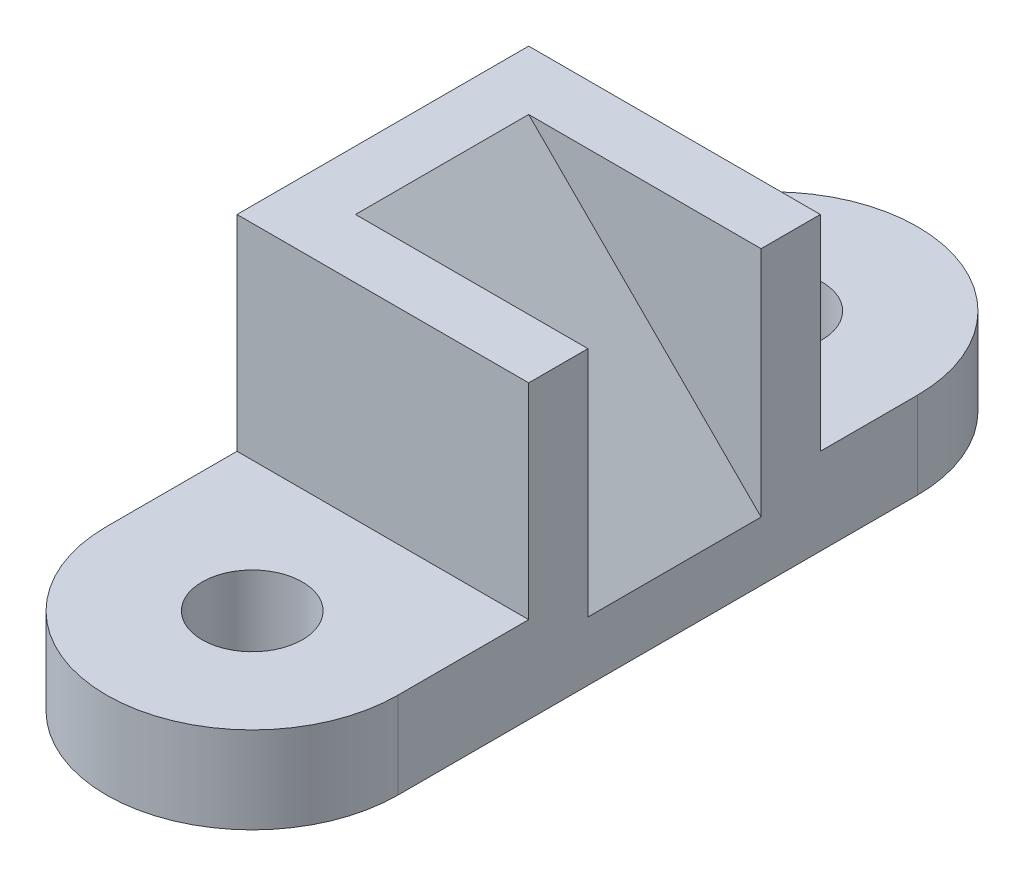
ISO-10303-21;
HEADER;
FILE_DESCRIPTION(('STEP AP214'),'2;1');
FILE_NAME('part.step','',(''),(''),'','','');
FILE_SCHEMA(('AUTOMOTIVE_DESIGN { 1 0 10303 214 1 1 1 1 }'));
ENDSEC;
DATA;
#1=APPLICATION_CONTEXT('core data for automotive mechanical design processes');
#2=APPLICATION_PROTOCOL_DEFINITION('international standard','automotive_design',2000,#1);
#3=PRODUCT_CONTEXT('',#1,'mechanical');
#4=PRODUCT('Part','Part','',(#3));
#5=PRODUCT_RELATED_PRODUCT_CATEGORY('part','',(#4));
#6=PRODUCT_DEFINITION_FORMATION('','',#4);
#7=PRODUCT_DEFINITION_CONTEXT('part definition',#1,'design');
#8=PRODUCT_DEFINITION('design','',#6,#7);
#9=PRODUCT_DEFINITION_SHAPE('','',#8);
#10=(LENGTH_UNIT() NAMED_UNIT(*) SI_UNIT(.MILLI.,.METRE.));
#11=(NAMED_UNIT(*) PLANE_ANGLE_UNIT() SI_UNIT($,.RADIAN.));
#12=(NAMED_UNIT(*) SI_UNIT($,.STERADIAN.) SOLID_ANGLE_UNIT());
#13=UNCERTAINTY_MEASURE_WITH_UNIT(LENGTH_MEASURE(1.E-05),#10,'distance_accuracy_value','');
#14=(GEOMETRIC_REPRESENTATION_CONTEXT(3) GLOBAL_UNCERTAINTY_ASSIGNED_CONTEXT((#13)) GLOBAL_UNIT_ASSIGNED_CONTEXT((#10,
#11,#12)) REPRESENTATION_CONTEXT('',''));
#15=CARTESIAN_POINT('',(0.,0.,0.));
#16=DIRECTION('',(0.,0.,1.));
#17=DIRECTION('',(1.,0.,0.));
#18=AXIS2_PLACEMENT_3D('',#15,#16,#17);
#19=CARTESIAN_POINT('',(0.,640.,156.794238497178));
#20=DIRECTION('',(0.,0.,1.));
#21=DIRECTION('',(1.,0.,0.));
#22=AXIS2_PLACEMENT_3D('',#19,#20,#21);
#23=PLANE('',#22);
#24=DIRECTION('',(-0.707106781186561,0.707106781186534,0.));
#25=VECTOR('',#24,1.);
#26=CARTESIAN_POINT('',(-192.180061252515,640.,156.794238497178));
#27=LINE('',#26,#25);
#28=CARTESIAN_POINT('',(317.819938747505,130.,156.794238497178));
#29=VERTEX_POINT('',#28);
#30=CARTESIAN_POINT('',(-192.180061252515,640.,156.794238497178));
#31=VERTEX_POINT('',#30);
#32=EDGE_CURVE('E50',#29,#31,#27,.T.);
#33=ORIENTED_EDGE('',*,*,#32,.T.);
#34=DIRECTION('',(-1.,0.,0.));
#35=VECTOR('',#34,1.);
#36=CARTESIAN_POINT('',(0.,640.,156.794238497178));
#37=LINE('',#36,#35);
#38=CARTESIAN_POINT('',(317.819938747505,640.,156.794238497178));
#39=VERTEX_POINT('',#38);
#40=EDGE_CURVE('E123',#39,#31,#37,.T.);
#41=ORIENTED_EDGE('',*,*,#40,.F.);
#42=DIRECTION('',(0.,-1.,0.));
#43=VECTOR('',#42,1.);
#44=CARTESIAN_POINT('',(317.819938747505,640.,156.794238497178));
#45=LINE('',#44,#43);
#46=EDGE_CURVE('E128',#39,#29,#45,.T.);
#47=ORIENTED_EDGE('',*,*,#46,.T.);
#48=EDGE_LOOP('',(#33,#41,#47));
#49=FACE_BOUND('',#48,.T.);
#50=ADVANCED_FACE('F35',(#49),#23,.F.);
#51=CARTESIAN_POINT('',(0.,640.,-223.205761502822));
#52=DIRECTION('',(0.,0.,-1.));
#53=DIRECTION('',(-1.,0.,0.));
#54=AXIS2_PLACEMENT_3D('',#51,#52,#53);
#55=PLANE('',#54);
#56=DIRECTION('',(-0.707106781186561,0.707106781186534,0.));
#57=VECTOR('',#56,1.);
#58=CARTESIAN_POINT('',(-192.180061252515,640.,-223.205761502822));
#59=LINE('',#58,#57);
#60=CARTESIAN_POINT('',(317.819938747505,130.,-223.205761502822));
#61=VERTEX_POINT('',#60);
#62=CARTESIAN_POINT('',(-192.180061252515,640.,-223.205761502822));
#63=VERTEX_POINT('',#62);
#64=EDGE_CURVE('E118',#61,#63,#59,.T.);
#65=ORIENTED_EDGE('',*,*,#64,.F.);
#66=DIRECTION('',(0.,-1.,0.));
#67=VECTOR('',#66,1.);
#68=CARTESIAN_POINT('',(317.819938747505,640.,-223.205761502822));
#69=LINE('',#68,#67);
#70=CARTESIAN_POINT('',(317.819938747505,640.,-223.205761502822));
#71=VERTEX_POINT('',#70);
#72=EDGE_CURVE('E144',#71,#61,#69,.T.);
#73=ORIENTED_EDGE('',*,*,#72,.F.);
#74=DIRECTION('',(1.,0.,0.));
#75=VECTOR('',#74,1.);
#76=CARTESIAN_POINT('',(0.,640.,-223.205761502822));
#77=LINE('',#76,#75);
#78=EDGE_CURVE('E122',#63,#71,#77,.T.);
#79=ORIENTED_EDGE('',*,*,#78,.F.);
#80=EDGE_LOOP('',(#65,#73,#79));
#81=FACE_BOUND('',#80,.T.);
#82=ADVANCED_FACE('F245',(#81),#55,.F.);
#83=CARTESIAN_POINT('',(-2.18006125250547,190.,573.391608020131));
#84=DIRECTION('',(0.,-1.,0.));
#85=DIRECTION('',(0.,0.,-1.));
#86=AXIS2_PLACEMENT_3D('',#83,#84,#85);
#87=CYLINDRICAL_SURFACE('',#86,320.00000000001);
#88=CARTESIAN_POINT('',(-2.18006125250547,0.,573.391608020131));
#89=DIRECTION('',(0.,1.,0.));
#90=DIRECTION('',(0.,0.,1.));
#91=AXIS2_PLACEMENT_3D('',#88,#89,#90);
#92=CIRCLE('',#91,320.00000000001);
#93=CARTESIAN_POINT('',(317.819938747505,0.,573.391608020131));
#94=VERTEX_POINT('',#93);
#95=CARTESIAN_POINT('',(-322.180061252515,0.,573.391608020131));
#96=VERTEX_POINT('',#95);
#97=EDGE_CURVE('E157',#94,#96,#92,.F.);
#98=ORIENTED_EDGE('',*,*,#97,.F.);
#99=DIRECTION('',(0.,-1.,0.));
#100=VECTOR('',#99,1.);
#101=CARTESIAN_POINT('',(317.819938747505,190.,573.391608020131));
#102=LINE('',#101,#100);
#103=CARTESIAN_POINT('',(317.819938747505,190.,573.391608020131));
#104=VERTEX_POINT('',#103);
#105=EDGE_CURVE('E11',#104,#94,#102,.T.);
#106=ORIENTED_EDGE('',*,*,#105,.F.);
#107=CARTESIAN_POINT('',(-2.18006125250547,190.,573.391608020131));
#108=DIRECTION('',(0.,1.,0.));
#109=DIRECTION('',(0.,0.,1.));
#110=AXIS2_PLACEMENT_3D('',#107,#108,#109);
#111=CIRCLE('',#110,320.00000000001);
#112=CARTESIAN_POINT('',(-322.180061252515,190.,573.391608020131));
#113=VERTEX_POINT('',#112);
#114=EDGE_CURVE('E158',#104,#113,#111,.F.);
#115=ORIENTED_EDGE('',*,*,#114,.T.);
#116=DIRECTION('',(0.,-1.,0.));
#117=VECTOR('',#116,1.);
#118=CARTESIAN_POINT('',(-322.180061252515,190.,573.391608020131));
#119=LINE('',#118,#117);
#120=EDGE_CURVE('E43',#113,#96,#119,.T.);
#121=ORIENTED_EDGE('',*,*,#120,.T.);
#122=EDGE_LOOP('',(#98,#106,#115,#121));
#123=FACE_BOUND('',#122,.T.);
#124=ADVANCED_FACE('F37',(#123),#87,.T.);
#125=CARTESIAN_POINT('',(317.819938747505,190.,0.));
#126=DIRECTION('',(1.,0.,0.));
#127=DIRECTION('',(0.,0.,-1.));
#128=AXIS2_PLACEMENT_3D('',#125,#126,#127);
#129=PLANE('',#128);
#130=DIRECTION('',(0.,0.,1.));
#131=VECTOR('',#130,1.);
#132=CARTESIAN_POINT('',(317.819938747505,0.,0.));
#133=LINE('',#132,#131);
#134=CARTESIAN_POINT('',(317.819938747505,0.,-566.608391979868));
#135=VERTEX_POINT('',#134);
#136=EDGE_CURVE('E175',#135,#94,#133,.T.);
#137=ORIENTED_EDGE('',*,*,#136,.F.);
#138=DIRECTION('',(0.,-1.,0.));
#139=VECTOR('',#138,1.);
#140=CARTESIAN_POINT('',(317.819938747505,190.,-566.608391979868));
#141=LINE('',#140,#139);
#142=CARTESIAN_POINT('',(317.819938747505,190.,-566.608391979868));
#143=VERTEX_POINT('',#142);
#144=EDGE_CURVE('E202',#143,#135,#141,.T.);
#145=ORIENTED_EDGE('',*,*,#144,.F.);
#146=DIRECTION('',(0.,0.,1.));
#147=VECTOR('',#146,1.);
#148=CARTESIAN_POINT('',(317.819938747505,190.,0.));
#149=LINE('',#148,#147);
#150=CARTESIAN_POINT('',(317.819938747505,190.,-353.205761502822));
#151=VERTEX_POINT('',#150);
#152=EDGE_CURVE('E213',#143,#151,#149,.T.);
#153=ORIENTED_EDGE('',*,*,#152,.T.);
#154=DIRECTION('',(0.,-1.,0.));
#155=VECTOR('',#154,1.);
#156=CARTESIAN_POINT('',(317.819938747505,640.,-353.205761502822));
#157=LINE('',#156,#155);
#158=CARTESIAN_POINT('',(317.819938747505,640.,-353.205761502822));
#159=VERTEX_POINT('',#158);
#160=EDGE_CURVE('E155',#159,#151,#157,.T.);
#161=ORIENTED_EDGE('',*,*,#160,.F.);
#162=DIRECTION('',(0.,0.,1.));
#163=VECTOR('',#162,1.);
#164=CARTESIAN_POINT('',(317.819938747505,640.,0.));
#165=LINE('',#164,#163);
#166=EDGE_CURVE('E139',#159,#71,#165,.T.);
#167=ORIENTED_EDGE('',*,*,#166,.T.);
#168=ORIENTED_EDGE('',*,*,#72,.T.);
#169=DIRECTION('',(0.,0.,1.));
#170=VECTOR('',#169,1.);
#171=CARTESIAN_POINT('',(317.819938747505,130.,0.));
#172=LINE('',#171,#170);
#173=EDGE_CURVE('E230',#61,#29,#172,.T.);
#174=ORIENTED_EDGE('',*,*,#173,.T.);
#175=ORIENTED_EDGE('',*,*,#46,.F.);
#176=CARTESIAN_POINT('',(317.819938747505,640.,286.794238497178));
#177=VERTEX_POINT('',#176);
#178=EDGE_CURVE('E135',#39,#177,#165,.T.);
#179=ORIENTED_EDGE('',*,*,#178,.T.);
#180=DIRECTION('',(0.,-1.,0.));
#181=VECTOR('',#180,1.);
#182=CARTESIAN_POINT('',(317.819938747505,640.,286.794238497178));
#183=LINE('',#182,#181);
#184=CARTESIAN_POINT('',(317.819938747505,190.,286.794238497178));
#185=VERTEX_POINT('',#184);
#186=EDGE_CURVE('E148',#177,#185,#183,.T.);
#187=ORIENTED_EDGE('',*,*,#186,.T.);
#188=DIRECTION('',(0.,0.,1.));
#189=VECTOR('',#188,1.);
#190=CARTESIAN_POINT('',(317.819938747505,190.,0.));
#191=LINE('',#190,#189);
#192=EDGE_CURVE('E161',#185,#104,#191,.T.);
#193=ORIENTED_EDGE('',*,*,#192,.T.);
#194=ORIENTED_EDGE('',*,*,#105,.T.);
#195=EDGE_LOOP('',(#137,#145,#153,#161,#167,#168,#174,#175,#179,#187,#193,#194));
#196=FACE_BOUND('',#195,.T.);
#197=ADVANCED_FACE('F200',(#196),#129,.T.);
#198=CARTESIAN_POINT('',(-322.180061252515,190.,0.));
#199=DIRECTION('',(1.,0.,0.));
#200=DIRECTION('',(0.,0.,-1.));
#201=AXIS2_PLACEMENT_3D('',#198,#199,#200);
#202=PLANE('',#201);
#203=DIRECTION('',(0.,0.,1.));
#204=VECTOR('',#203,1.);
#205=CARTESIAN_POINT('',(-322.180061252515,0.,0.));
#206=LINE('',#205,#204);
#207=CARTESIAN_POINT('',(-322.180061252515,0.,-566.608391979869));
#208=VERTEX_POINT('',#207);
#209=EDGE_CURVE('E178',#208,#96,#206,.T.);
#210=ORIENTED_EDGE('',*,*,#209,.T.);
#211=ORIENTED_EDGE('',*,*,#120,.F.);
#212=DIRECTION('',(0.,0.,1.));
#213=VECTOR('',#212,1.);
#214=CARTESIAN_POINT('',(-322.180061252515,190.,0.));
#215=LINE('',#214,#213);
#216=CARTESIAN_POINT('',(-322.180061252515,190.,286.794238497178));
#217=VERTEX_POINT('',#216);
#218=EDGE_CURVE('E168',#217,#113,#215,.T.);
#219=ORIENTED_EDGE('',*,*,#218,.F.);
#220=DIRECTION('',(0.,-1.,0.));
#221=VECTOR('',#220,1.);
#222=CARTESIAN_POINT('',(-322.180061252515,640.,286.794238497178));
#223=LINE('',#222,#221);
#224=CARTESIAN_POINT('',(-322.180061252515,640.,286.794238497178));
#225=VERTEX_POINT('',#224);
#226=EDGE_CURVE('E151',#225,#217,#223,.T.);
#227=ORIENTED_EDGE('',*,*,#226,.F.);
#228=DIRECTION('',(0.,0.,1.));
#229=VECTOR('',#228,1.);
#230=CARTESIAN_POINT('',(-322.180061252515,640.,0.));
#231=LINE('',#230,#229);
#232=CARTESIAN_POINT('',(-322.180061252515,640.,-353.205761502822));
#233=VERTEX_POINT('',#232);
#234=EDGE_CURVE('E222',#233,#225,#231,.T.);
#235=ORIENTED_EDGE('',*,*,#234,.F.);
#236=DIRECTION('',(0.,-1.,0.));
#237=VECTOR('',#236,1.);
#238=CARTESIAN_POINT('',(-322.180061252515,640.,-353.205761502822));
#239=LINE('',#238,#237);
#240=CARTESIAN_POINT('',(-322.180061252515,190.,-353.205761502822));
#241=VERTEX_POINT('',#240);
#242=EDGE_CURVE('E153',#233,#241,#239,.T.);
#243=ORIENTED_EDGE('',*,*,#242,.T.);
#244=DIRECTION('',(0.,0.,1.));
#245=VECTOR('',#244,1.);
#246=CARTESIAN_POINT('',(-322.180061252515,190.,0.));
#247=LINE('',#246,#245);
#248=CARTESIAN_POINT('',(-322.180061252515,190.,-566.608391979869));
#249=VERTEX_POINT('',#248);
#250=EDGE_CURVE('E236',#249,#241,#247,.T.);
#251=ORIENTED_EDGE('',*,*,#250,.F.);
#252=DIRECTION('',(0.,-1.,0.));
#253=VECTOR('',#252,1.);
#254=CARTESIAN_POINT('',(-322.180061252515,190.,-566.608391979869));
#255=LINE('',#254,#253);
#256=EDGE_CURVE('E191',#249,#208,#255,.T.);
#257=ORIENTED_EDGE('',*,*,#256,.T.);
#258=EDGE_LOOP('',(#210,#211,#219,#227,#235,#243,#251,#257));
#259=FACE_BOUND('',#258,.T.);
#260=ADVANCED_FACE('F189',(#259),#202,.F.);
#261=CARTESIAN_POINT('',(-2.18006125250547,190.,573.391608020131));
#262=DIRECTION('',(0.,-1.,0.));
#263=DIRECTION('',(0.,0.,-1.));
#264=AXIS2_PLACEMENT_3D('',#261,#262,#263);
#265=CYLINDRICAL_SURFACE('',#264,110.);
#266=CARTESIAN_POINT('',(-2.18006125250547,190.,573.391608020131));
#267=DIRECTION('',(0.,1.,0.));
#268=DIRECTION('',(0.,0.,1.));
#269=AXIS2_PLACEMENT_3D('',#266,#267,#268);
#270=CIRCLE('',#269,110.);
#271=CARTESIAN_POINT('',(-2.18006125250547,190.,683.391608020131));
#272=VERTEX_POINT('',#271);
#273=EDGE_CURVE('E170',#272,#272,#270,.T.);
#274=ORIENTED_EDGE('',*,*,#273,.T.);
#275=EDGE_LOOP('',(#274));
#276=FACE_BOUND('',#275,.T.);
#277=CARTESIAN_POINT('',(-2.18006125250547,0.,573.391608020131));
#278=DIRECTION('',(0.,1.,0.));
#279=DIRECTION('',(0.,0.,1.));
#280=AXIS2_PLACEMENT_3D('',#277,#278,#279);
#281=CIRCLE('',#280,110.);
#282=CARTESIAN_POINT('',(-2.18006125250547,0.,683.391608020131));
#283=VERTEX_POINT('',#282);
#284=EDGE_CURVE('E162',#283,#283,#281,.T.);
#285=ORIENTED_EDGE('',*,*,#284,.F.);
#286=EDGE_LOOP('',(#285));
#287=FACE_BOUND('',#286,.T.);
#288=ADVANCED_FACE('F263',(#276,#287),#265,.F.);
#289=CARTESIAN_POINT('',(0.,190.,0.));
#290=DIRECTION('',(0.,1.,0.));
#291=DIRECTION('',(0.,0.,1.));
#292=AXIS2_PLACEMENT_3D('',#289,#290,#291);
#293=PLANE('',#292);
#294=ORIENTED_EDGE('',*,*,#114,.F.);
#295=ORIENTED_EDGE('',*,*,#192,.F.);
#296=DIRECTION('',(-1.,0.,0.));
#297=VECTOR('',#296,1.);
#298=CARTESIAN_POINT('',(0.,190.,286.794238497178));
#299=LINE('',#298,#297);
#300=EDGE_CURVE('E165',#185,#217,#299,.T.);
#301=ORIENTED_EDGE('',*,*,#300,.T.);
#302=ORIENTED_EDGE('',*,*,#218,.T.);
#303=EDGE_LOOP('',(#294,#295,#301,#302));
#304=FACE_BOUND('',#303,.T.);
#305=ORIENTED_EDGE('',*,*,#273,.F.);
#306=EDGE_LOOP('',(#305));
#307=FACE_BOUND('',#306,.T.);
#308=ADVANCED_FACE('F260',(#304,#307),#293,.T.);
#309=CARTESIAN_POINT('',(0.,0.,0.));
#310=DIRECTION('',(0.,1.,0.));
#311=DIRECTION('',(0.,0.,1.));
#312=AXIS2_PLACEMENT_3D('',#309,#310,#311);
#313=PLANE('',#312);
#314=CARTESIAN_POINT('',(-2.18006125250558,0.,-566.608391979869));
#315=DIRECTION('',(0.,1.,0.));
#316=DIRECTION('',(0.,0.,1.));
#317=AXIS2_PLACEMENT_3D('',#314,#315,#316);
#318=CIRCLE('',#317,320.00000000001);
#319=EDGE_CURVE('E197',#208,#135,#318,.F.);
#320=ORIENTED_EDGE('',*,*,#319,.T.);
#321=ORIENTED_EDGE('',*,*,#136,.T.);
#322=ORIENTED_EDGE('',*,*,#97,.T.);
#323=ORIENTED_EDGE('',*,*,#209,.F.);
#324=EDGE_LOOP('',(#320,#321,#322,#323));
#325=FACE_BOUND('',#324,.T.);
#326=ORIENTED_EDGE('',*,*,#284,.T.);
#327=EDGE_LOOP('',(#326));
#328=FACE_BOUND('',#327,.T.);
#329=CARTESIAN_POINT('',(-2.18006125250558,0.,-566.608391979869));
#330=DIRECTION('',(0.,1.,0.));
#331=DIRECTION('',(0.,0.,1.));
#332=AXIS2_PLACEMENT_3D('',#329,#330,#331);
#333=CIRCLE('',#332,110.);
#334=CARTESIAN_POINT('',(-2.18006125250558,0.,-456.608391979868));
#335=VERTEX_POINT('',#334);
#336=EDGE_CURVE('E216',#335,#335,#333,.T.);
#337=ORIENTED_EDGE('',*,*,#336,.T.);
#338=EDGE_LOOP('',(#337));
#339=FACE_BOUND('',#338,.T.);
#340=ADVANCED_FACE('F195',(#325,#328,#339),#313,.F.);
#341=CARTESIAN_POINT('',(0.,640.,286.794238497178));
#342=DIRECTION('',(0.,0.,1.));
#343=DIRECTION('',(1.,0.,0.));
#344=AXIS2_PLACEMENT_3D('',#341,#342,#343);
#345=PLANE('',#344);
#346=ORIENTED_EDGE('',*,*,#300,.F.);
#347=ORIENTED_EDGE('',*,*,#186,.F.);
#348=DIRECTION('',(-1.,0.,0.));
#349=VECTOR('',#348,1.);
#350=CARTESIAN_POINT('',(0.,640.,286.794238497178));
#351=LINE('',#350,#349);
#352=EDGE_CURVE('E137',#177,#225,#351,.T.);
#353=ORIENTED_EDGE('',*,*,#352,.T.);
#354=ORIENTED_EDGE('',*,*,#226,.T.);
#355=EDGE_LOOP('',(#346,#347,#353,#354));
#356=FACE_BOUND('',#355,.T.);
#357=ADVANCED_FACE('F228',(#356),#345,.T.);
#358=CARTESIAN_POINT('',(0.,640.,-353.205761502822));
#359=DIRECTION('',(0.,0.,-1.));
#360=DIRECTION('',(-1.,0.,0.));
#361=AXIS2_PLACEMENT_3D('',#358,#359,#360);
#362=PLANE('',#361);
#363=DIRECTION('',(1.,0.,0.));
#364=VECTOR('',#363,1.);
#365=CARTESIAN_POINT('',(0.,190.,-353.205761502822));
#366=LINE('',#365,#364);
#367=EDGE_CURVE('E58',#241,#151,#366,.T.);
#368=ORIENTED_EDGE('',*,*,#367,.F.);
#369=ORIENTED_EDGE('',*,*,#242,.F.);
#370=DIRECTION('',(1.,0.,0.));
#371=VECTOR('',#370,1.);
#372=CARTESIAN_POINT('',(0.,640.,-353.205761502822));
#373=LINE('',#372,#371);
#374=EDGE_CURVE('E220',#233,#159,#373,.T.);
#375=ORIENTED_EDGE('',*,*,#374,.T.);
#376=ORIENTED_EDGE('',*,*,#160,.T.);
#377=EDGE_LOOP('',(#368,#369,#375,#376));
#378=FACE_BOUND('',#377,.T.);
#379=ADVANCED_FACE('F243',(#378),#362,.T.);
#380=CARTESIAN_POINT('',(0.,640.,0.));
#381=DIRECTION('',(0.,1.,0.));
#382=DIRECTION('',(0.,0.,1.));
#383=AXIS2_PLACEMENT_3D('',#380,#381,#382);
#384=PLANE('',#383);
#385=ORIENTED_EDGE('',*,*,#166,.F.);
#386=ORIENTED_EDGE('',*,*,#374,.F.);
#387=ORIENTED_EDGE('',*,*,#234,.T.);
#388=ORIENTED_EDGE('',*,*,#352,.F.);
#389=ORIENTED_EDGE('',*,*,#178,.F.);
#390=ORIENTED_EDGE('',*,*,#40,.T.);
#391=DIRECTION('',(0.,0.,1.));
#392=VECTOR('',#391,1.);
#393=CARTESIAN_POINT('',(-192.180061252515,640.,0.));
#394=LINE('',#393,#392);
#395=EDGE_CURVE('E115',#63,#31,#394,.T.);
#396=ORIENTED_EDGE('',*,*,#395,.F.);
#397=ORIENTED_EDGE('',*,*,#78,.T.);
#398=EDGE_LOOP('',(#385,#386,#387,#388,#389,#390,#396,#397));
#399=FACE_BOUND('',#398,.T.);
#400=ADVANCED_FACE('F132',(#399),#384,.T.);
#401=CARTESIAN_POINT('',(-2.18006125250558,190.,-566.608391979869));
#402=DIRECTION('',(0.,-1.,0.));
#403=DIRECTION('',(0.,0.,-1.));
#404=AXIS2_PLACEMENT_3D('',#401,#402,#403);
#405=CYLINDRICAL_SURFACE('',#404,320.00000000001);
#406=ORIENTED_EDGE('',*,*,#319,.F.);
#407=ORIENTED_EDGE('',*,*,#256,.F.);
#408=CARTESIAN_POINT('',(-2.18006125250558,190.,-566.608391979869));
#409=DIRECTION('',(0.,1.,0.));
#410=DIRECTION('',(0.,0.,1.));
#411=AXIS2_PLACEMENT_3D('',#408,#409,#410);
#412=CIRCLE('',#411,320.00000000001);
#413=EDGE_CURVE('E207',#249,#143,#412,.F.);
#414=ORIENTED_EDGE('',*,*,#413,.T.);
#415=ORIENTED_EDGE('',*,*,#144,.T.);
#416=EDGE_LOOP('',(#406,#407,#414,#415));
#417=FACE_BOUND('',#416,.T.);
#418=ADVANCED_FACE('F205',(#417),#405,.T.);
#419=CARTESIAN_POINT('',(-2.18006125250558,190.,-566.608391979869));
#420=DIRECTION('',(0.,-1.,0.));
#421=DIRECTION('',(0.,0.,-1.));
#422=AXIS2_PLACEMENT_3D('',#419,#420,#421);
#423=CYLINDRICAL_SURFACE('',#422,110.);
#424=CARTESIAN_POINT('',(-2.18006125250558,190.,-566.608391979869));
#425=DIRECTION('',(0.,1.,0.));
#426=DIRECTION('',(0.,0.,1.));
#427=AXIS2_PLACEMENT_3D('',#424,#425,#426);
#428=CIRCLE('',#427,110.);
#429=CARTESIAN_POINT('',(-2.18006125250558,190.,-456.608391979868));
#430=VERTEX_POINT('',#429);
#431=EDGE_CURVE('E209',#430,#430,#428,.T.);
#432=ORIENTED_EDGE('',*,*,#431,.T.);
#433=EDGE_LOOP('',(#432));
#434=FACE_BOUND('',#433,.T.);
#435=ORIENTED_EDGE('',*,*,#336,.F.);
#436=EDGE_LOOP('',(#435));
#437=FACE_BOUND('',#436,.T.);
#438=ADVANCED_FACE('F314',(#434,#437),#423,.F.);
#439=CARTESIAN_POINT('',(0.,190.,0.));
#440=DIRECTION('',(0.,1.,0.));
#441=DIRECTION('',(0.,0.,1.));
#442=AXIS2_PLACEMENT_3D('',#439,#440,#441);
#443=PLANE('',#442);
#444=ORIENTED_EDGE('',*,*,#413,.F.);
#445=ORIENTED_EDGE('',*,*,#250,.T.);
#446=ORIENTED_EDGE('',*,*,#367,.T.);
#447=ORIENTED_EDGE('',*,*,#152,.F.);
#448=EDGE_LOOP('',(#444,#445,#446,#447));
#449=FACE_BOUND('',#448,.T.);
#450=ORIENTED_EDGE('',*,*,#431,.F.);
#451=EDGE_LOOP('',(#450));
#452=FACE_BOUND('',#451,.T.);
#453=ADVANCED_FACE('F241',(#449,#452),#443,.T.);
#454=CARTESIAN_POINT('',(-192.180061252515,640.,893.393608020141));
#455=DIRECTION('',(-0.707106781186534,-0.707106781186561,0.));
#456=DIRECTION('',(0.707106781186561,-0.707106781186534,0.));
#457=AXIS2_PLACEMENT_3D('',#454,#455,#456);
#458=PLANE('',#457);
#459=ORIENTED_EDGE('',*,*,#32,.F.);
#460=ORIENTED_EDGE('',*,*,#173,.F.);
#461=ORIENTED_EDGE('',*,*,#64,.T.);
#462=ORIENTED_EDGE('',*,*,#395,.T.);
#463=EDGE_LOOP('',(#459,#460,#461,#462));
#464=FACE_BOUND('',#463,.T.);
#465=ADVANCED_FACE('F116',(#464),#458,.F.);
#466=CLOSED_SHELL('',(#50,#82,#124,#197,#260,#288,#308,#340,#357,#379,#400,#418,#438,#453,#465));
#467=MANIFOLD_SOLID_BREP('B2',#466);
#468=ADVANCED_BREP_SHAPE_REPRESENTATION('',(#18,#467),#14);
#469=SHAPE_DEFINITION_REPRESENTATION(#9,#468);
ENDSEC;
END-ISO-10303-21;
